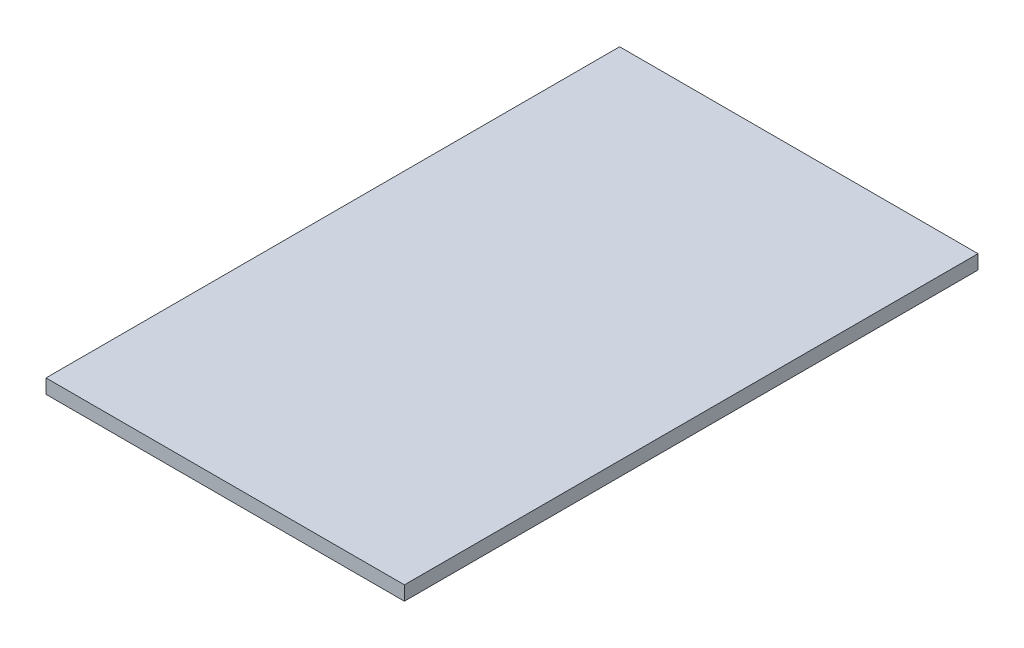
ISO-10303-21;
HEADER;
FILE_DESCRIPTION(('STEP AP214'),'2;1');
FILE_NAME('part.step','',(''),(''),'','','');
FILE_SCHEMA(('AUTOMOTIVE_DESIGN { 1 0 10303 214 1 1 1 1 }'));
ENDSEC;
DATA;
#1=APPLICATION_CONTEXT('core data for automotive mechanical design processes');
#2=APPLICATION_PROTOCOL_DEFINITION('international standard','automotive_design',2000,#1);
#3=PRODUCT_CONTEXT('',#1,'mechanical');
#4=PRODUCT('Part','Part','',(#3));
#5=PRODUCT_RELATED_PRODUCT_CATEGORY('part','',(#4));
#6=PRODUCT_DEFINITION_FORMATION('','',#4);
#7=PRODUCT_DEFINITION_CONTEXT('part definition',#1,'design');
#8=PRODUCT_DEFINITION('design','',#6,#7);
#9=PRODUCT_DEFINITION_SHAPE('','',#8);
#10=(LENGTH_UNIT() NAMED_UNIT(*) SI_UNIT(.MILLI.,.METRE.));
#11=(NAMED_UNIT(*) PLANE_ANGLE_UNIT() SI_UNIT($,.RADIAN.));
#12=(NAMED_UNIT(*) SI_UNIT($,.STERADIAN.) SOLID_ANGLE_UNIT());
#13=UNCERTAINTY_MEASURE_WITH_UNIT(LENGTH_MEASURE(1.E-05),#10,'distance_accuracy_value','');
#14=(GEOMETRIC_REPRESENTATION_CONTEXT(3) GLOBAL_UNCERTAINTY_ASSIGNED_CONTEXT((#13)) GLOBAL_UNIT_ASSIGNED_CONTEXT((#10,
#11,#12)) REPRESENTATION_CONTEXT('',''));
#15=CARTESIAN_POINT('',(0.,0.,0.));
#16=DIRECTION('',(0.,0.,1.));
#17=DIRECTION('',(1.,0.,0.));
#18=AXIS2_PLACEMENT_3D('',#15,#16,#17);
#19=CARTESIAN_POINT('',(-35.4136363636364,3.,-23.6727272727273));
#20=DIRECTION('',(1.,0.,0.));
#21=DIRECTION('',(0.,0.,-1.));
#22=AXIS2_PLACEMENT_3D('',#19,#20,#21);
#23=PLANE('',#22);
#24=DIRECTION('',(0.,0.,1.));
#25=VECTOR('',#24,1.);
#26=CARTESIAN_POINT('',(-35.4136363636364,0.,-23.6727272727273));
#27=LINE('',#26,#25);
#28=CARTESIAN_POINT('',(-35.4136363636364,0.,-23.6727272727273));
#29=VERTEX_POINT('',#28);
#30=CARTESIAN_POINT('',(-35.4136363636364,0.,97.3272727272727));
#31=VERTEX_POINT('',#30);
#32=EDGE_CURVE('E107',#29,#31,#27,.T.);
#33=ORIENTED_EDGE('',*,*,#32,.T.);
#34=DIRECTION('',(0.,-1.,0.));
#35=VECTOR('',#34,1.);
#36=CARTESIAN_POINT('',(-35.4136363636364,3.,97.3272727272727));
#37=LINE('',#36,#35);
#38=CARTESIAN_POINT('',(-35.4136363636364,3.,97.3272727272727));
#39=VERTEX_POINT('',#38);
#40=EDGE_CURVE('E11',#39,#31,#37,.T.);
#41=ORIENTED_EDGE('',*,*,#40,.F.);
#42=DIRECTION('',(0.,0.,1.));
#43=VECTOR('',#42,1.);
#44=CARTESIAN_POINT('',(-35.4136363636364,3.,-23.6727272727273));
#45=LINE('',#44,#43);
#46=CARTESIAN_POINT('',(-35.4136363636364,3.,-23.6727272727273));
#47=VERTEX_POINT('',#46);
#48=EDGE_CURVE('E91',#47,#39,#45,.T.);
#49=ORIENTED_EDGE('',*,*,#48,.F.);
#50=DIRECTION('',(0.,-1.,0.));
#51=VECTOR('',#50,1.);
#52=CARTESIAN_POINT('',(-35.4136363636364,3.,-23.6727272727273));
#53=LINE('',#52,#51);
#54=EDGE_CURVE('E103',#47,#29,#53,.T.);
#55=ORIENTED_EDGE('',*,*,#54,.T.);
#56=EDGE_LOOP('',(#33,#41,#49,#55));
#57=FACE_BOUND('',#56,.T.);
#58=ADVANCED_FACE('F39',(#57),#23,.F.);
#59=CARTESIAN_POINT('',(-35.4136363636364,3.,97.3272727272727));
#60=DIRECTION('',(0.,0.,-1.));
#61=DIRECTION('',(-1.,0.,0.));
#62=AXIS2_PLACEMENT_3D('',#59,#60,#61);
#63=PLANE('',#62);
#64=DIRECTION('',(1.,0.,0.));
#65=VECTOR('',#64,1.);
#66=CARTESIAN_POINT('',(-35.4136363636364,0.,97.3272727272727));
#67=LINE('',#66,#65);
#68=CARTESIAN_POINT('',(40.1863636363636,0.,97.3272727272727));
#69=VERTEX_POINT('',#68);
#70=EDGE_CURVE('E96',#31,#69,#67,.T.);
#71=ORIENTED_EDGE('',*,*,#70,.T.);
#72=DIRECTION('',(0.,-1.,0.));
#73=VECTOR('',#72,1.);
#74=CARTESIAN_POINT('',(40.1863636363636,3.,97.3272727272727));
#75=LINE('',#74,#73);
#76=CARTESIAN_POINT('',(40.1863636363636,3.,97.3272727272727));
#77=VERTEX_POINT('',#76);
#78=EDGE_CURVE('E48',#77,#69,#75,.T.);
#79=ORIENTED_EDGE('',*,*,#78,.F.);
#80=DIRECTION('',(1.,0.,0.));
#81=VECTOR('',#80,1.);
#82=CARTESIAN_POINT('',(-35.4136363636364,3.,97.3272727272727));
#83=LINE('',#82,#81);
#84=EDGE_CURVE('E86',#39,#77,#83,.T.);
#85=ORIENTED_EDGE('',*,*,#84,.F.);
#86=ORIENTED_EDGE('',*,*,#40,.T.);
#87=EDGE_LOOP('',(#71,#79,#85,#86));
#88=FACE_BOUND('',#87,.T.);
#89=ADVANCED_FACE('F95',(#88),#63,.F.);
#90=CARTESIAN_POINT('',(40.1863636363636,3.,-23.6727272727273));
#91=DIRECTION('',(-1.,0.,0.));
#92=DIRECTION('',(0.,0.,1.));
#93=AXIS2_PLACEMENT_3D('',#90,#91,#92);
#94=PLANE('',#93);
#95=DIRECTION('',(0.,0.,-1.));
#96=VECTOR('',#95,1.);
#97=CARTESIAN_POINT('',(40.1863636363636,0.,-23.6727272727273));
#98=LINE('',#97,#96);
#99=CARTESIAN_POINT('',(40.1863636363636,0.,-23.6727272727273));
#100=VERTEX_POINT('',#99);
#101=EDGE_CURVE('E73',#69,#100,#98,.T.);
#102=ORIENTED_EDGE('',*,*,#101,.T.);
#103=DIRECTION('',(0.,-1.,0.));
#104=VECTOR('',#103,1.);
#105=CARTESIAN_POINT('',(40.1863636363636,3.,-23.6727272727273));
#106=LINE('',#105,#104);
#107=CARTESIAN_POINT('',(40.1863636363636,3.,-23.6727272727273));
#108=VERTEX_POINT('',#107);
#109=EDGE_CURVE('E98',#108,#100,#106,.T.);
#110=ORIENTED_EDGE('',*,*,#109,.F.);
#111=DIRECTION('',(0.,0.,-1.));
#112=VECTOR('',#111,1.);
#113=CARTESIAN_POINT('',(40.1863636363636,3.,-23.6727272727273));
#114=LINE('',#113,#112);
#115=EDGE_CURVE('E89',#77,#108,#114,.T.);
#116=ORIENTED_EDGE('',*,*,#115,.F.);
#117=ORIENTED_EDGE('',*,*,#78,.T.);
#118=EDGE_LOOP('',(#102,#110,#116,#117));
#119=FACE_BOUND('',#118,.T.);
#120=ADVANCED_FACE('F99',(#119),#94,.F.);
#121=CARTESIAN_POINT('',(-35.4136363636364,3.,-23.6727272727273));
#122=DIRECTION('',(0.,0.,1.));
#123=DIRECTION('',(1.,0.,0.));
#124=AXIS2_PLACEMENT_3D('',#121,#122,#123);
#125=PLANE('',#124);
#126=DIRECTION('',(-1.,0.,0.));
#127=VECTOR('',#126,1.);
#128=CARTESIAN_POINT('',(-35.4136363636364,0.,-23.6727272727273));
#129=LINE('',#128,#127);
#130=EDGE_CURVE('E79',#100,#29,#129,.T.);
#131=ORIENTED_EDGE('',*,*,#130,.T.);
#132=ORIENTED_EDGE('',*,*,#54,.F.);
#133=DIRECTION('',(-1.,0.,0.));
#134=VECTOR('',#133,1.);
#135=CARTESIAN_POINT('',(-35.4136363636364,3.,-23.6727272727273));
#136=LINE('',#135,#134);
#137=EDGE_CURVE('E56',#108,#47,#136,.T.);
#138=ORIENTED_EDGE('',*,*,#137,.F.);
#139=ORIENTED_EDGE('',*,*,#109,.T.);
#140=EDGE_LOOP('',(#131,#132,#138,#139));
#141=FACE_BOUND('',#140,.T.);
#142=ADVANCED_FACE('F120',(#141),#125,.F.);
#143=CARTESIAN_POINT('',(0.,3.,0.));
#144=DIRECTION('',(0.,1.,0.));
#145=DIRECTION('',(0.,0.,1.));
#146=AXIS2_PLACEMENT_3D('',#143,#144,#145);
#147=PLANE('',#146);
#148=ORIENTED_EDGE('',*,*,#48,.T.);
#149=ORIENTED_EDGE('',*,*,#84,.T.);
#150=ORIENTED_EDGE('',*,*,#115,.T.);
#151=ORIENTED_EDGE('',*,*,#137,.T.);
#152=EDGE_LOOP('',(#148,#149,#150,#151));
#153=FACE_BOUND('',#152,.T.);
#154=ADVANCED_FACE('F87',(#153),#147,.T.);
#155=CARTESIAN_POINT('',(0.,0.,0.));
#156=DIRECTION('',(0.,1.,0.));
#157=DIRECTION('',(0.,0.,1.));
#158=AXIS2_PLACEMENT_3D('',#155,#156,#157);
#159=PLANE('',#158);
#160=ORIENTED_EDGE('',*,*,#32,.F.);
#161=ORIENTED_EDGE('',*,*,#130,.F.);
#162=ORIENTED_EDGE('',*,*,#101,.F.);
#163=ORIENTED_EDGE('',*,*,#70,.F.);
#164=EDGE_LOOP('',(#160,#161,#162,#163));
#165=FACE_BOUND('',#164,.T.);
#166=ADVANCED_FACE('F123',(#165),#159,.F.);
#167=CLOSED_SHELL('',(#58,#89,#120,#142,#154,#166));
#168=MANIFOLD_SOLID_BREP('B2',#167);
#169=ADVANCED_BREP_SHAPE_REPRESENTATION('',(#18,#168),#14);
#170=SHAPE_DEFINITION_REPRESENTATION(#9,#169);
ENDSEC;
END-ISO-10303-21;
